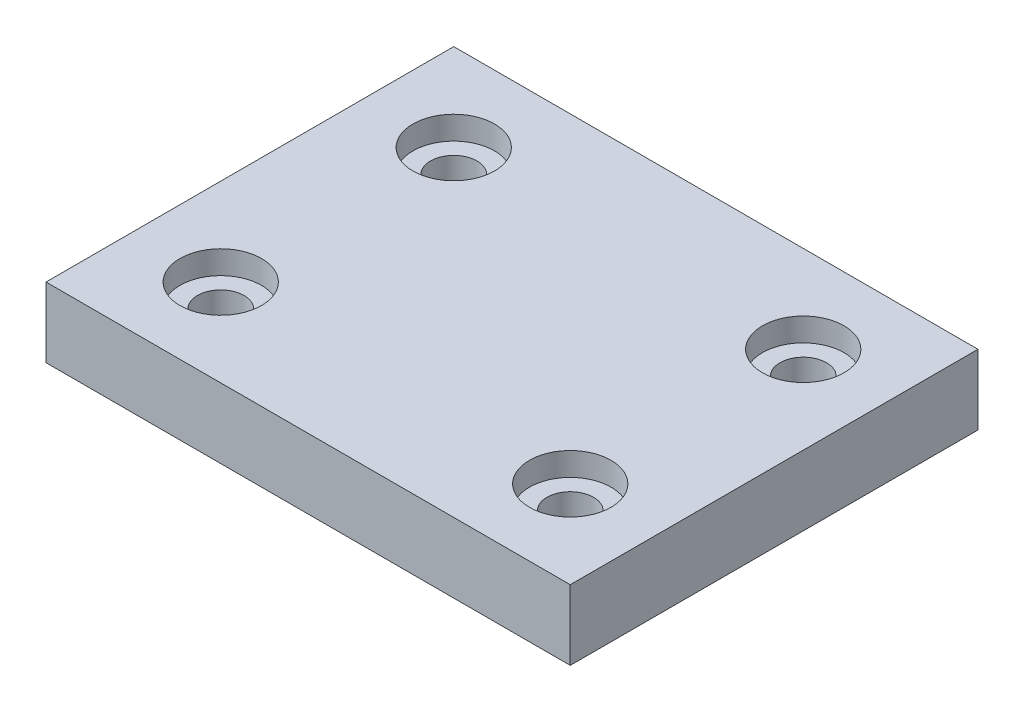
ISO-10303-21;
HEADER;
FILE_DESCRIPTION(('STEP AP214'),'2;1');
FILE_NAME('part.step','',(''),(''),'','','');
FILE_SCHEMA(('AUTOMOTIVE_DESIGN { 1 0 10303 214 1 1 1 1 }'));
ENDSEC;
DATA;
#1=APPLICATION_CONTEXT('core data for automotive mechanical design processes');
#2=APPLICATION_PROTOCOL_DEFINITION('international standard','automotive_design',2000,#1);
#3=PRODUCT_CONTEXT('',#1,'mechanical');
#4=PRODUCT('Part','Part','',(#3));
#5=PRODUCT_RELATED_PRODUCT_CATEGORY('part','',(#4));
#6=PRODUCT_DEFINITION_FORMATION('','',#4);
#7=PRODUCT_DEFINITION_CONTEXT('part definition',#1,'design');
#8=PRODUCT_DEFINITION('design','',#6,#7);
#9=PRODUCT_DEFINITION_SHAPE('','',#8);
#10=(LENGTH_UNIT() NAMED_UNIT(*) SI_UNIT(.MILLI.,.METRE.));
#11=(NAMED_UNIT(*) PLANE_ANGLE_UNIT() SI_UNIT($,.RADIAN.));
#12=(NAMED_UNIT(*) SI_UNIT($,.STERADIAN.) SOLID_ANGLE_UNIT());
#13=UNCERTAINTY_MEASURE_WITH_UNIT(LENGTH_MEASURE(1.E-05),#10,'distance_accuracy_value','');
#14=(GEOMETRIC_REPRESENTATION_CONTEXT(3) GLOBAL_UNCERTAINTY_ASSIGNED_CONTEXT((#13)) GLOBAL_UNIT_ASSIGNED_CONTEXT((#10,
#11,#12)) REPRESENTATION_CONTEXT('',''));
#15=CARTESIAN_POINT('',(0.,0.,0.));
#16=DIRECTION('',(0.,0.,1.));
#17=DIRECTION('',(1.,0.,0.));
#18=AXIS2_PLACEMENT_3D('',#15,#16,#17);
#19=CARTESIAN_POINT('',(-45.,12.,35.));
#20=DIRECTION('',(1.,0.,0.));
#21=DIRECTION('',(0.,0.,-1.));
#22=AXIS2_PLACEMENT_3D('',#19,#20,#21);
#23=PLANE('',#22);
#24=DIRECTION('',(0.,0.,1.));
#25=VECTOR('',#24,1.);
#26=CARTESIAN_POINT('',(-45.,0.,35.));
#27=LINE('',#26,#25);
#28=CARTESIAN_POINT('',(-45.,0.,-35.));
#29=VERTEX_POINT('',#28);
#30=CARTESIAN_POINT('',(-45.,0.,35.));
#31=VERTEX_POINT('',#30);
#32=EDGE_CURVE('E117',#29,#31,#27,.T.);
#33=ORIENTED_EDGE('',*,*,#32,.T.);
#34=DIRECTION('',(0.,-1.,0.));
#35=VECTOR('',#34,1.);
#36=CARTESIAN_POINT('',(-45.,12.,35.));
#37=LINE('',#36,#35);
#38=CARTESIAN_POINT('',(-45.,12.,35.));
#39=VERTEX_POINT('',#38);
#40=EDGE_CURVE('E11',#39,#31,#37,.T.);
#41=ORIENTED_EDGE('',*,*,#40,.F.);
#42=DIRECTION('',(0.,0.,1.));
#43=VECTOR('',#42,1.);
#44=CARTESIAN_POINT('',(-45.,12.,35.));
#45=LINE('',#44,#43);
#46=CARTESIAN_POINT('',(-45.,12.,-35.));
#47=VERTEX_POINT('',#46);
#48=EDGE_CURVE('E99',#47,#39,#45,.T.);
#49=ORIENTED_EDGE('',*,*,#48,.F.);
#50=DIRECTION('',(0.,-1.,0.));
#51=VECTOR('',#50,1.);
#52=CARTESIAN_POINT('',(-45.,12.,-35.));
#53=LINE('',#52,#51);
#54=EDGE_CURVE('E113',#47,#29,#53,.T.);
#55=ORIENTED_EDGE('',*,*,#54,.T.);
#56=EDGE_LOOP('',(#33,#41,#49,#55));
#57=FACE_BOUND('',#56,.T.);
#58=ADVANCED_FACE('F45',(#57),#23,.F.);
#59=CARTESIAN_POINT('',(45.,12.,35.));
#60=DIRECTION('',(0.,0.,-1.));
#61=DIRECTION('',(-1.,0.,0.));
#62=AXIS2_PLACEMENT_3D('',#59,#60,#61);
#63=PLANE('',#62);
#64=DIRECTION('',(1.,0.,0.));
#65=VECTOR('',#64,1.);
#66=CARTESIAN_POINT('',(45.,0.,35.));
#67=LINE('',#66,#65);
#68=CARTESIAN_POINT('',(45.,0.,35.));
#69=VERTEX_POINT('',#68);
#70=EDGE_CURVE('E104',#31,#69,#67,.T.);
#71=ORIENTED_EDGE('',*,*,#70,.T.);
#72=DIRECTION('',(0.,-1.,0.));
#73=VECTOR('',#72,1.);
#74=CARTESIAN_POINT('',(45.,12.,35.));
#75=LINE('',#74,#73);
#76=CARTESIAN_POINT('',(45.,12.,35.));
#77=VERTEX_POINT('',#76);
#78=EDGE_CURVE('E55',#77,#69,#75,.T.);
#79=ORIENTED_EDGE('',*,*,#78,.F.);
#80=DIRECTION('',(1.,0.,0.));
#81=VECTOR('',#80,1.);
#82=CARTESIAN_POINT('',(45.,12.,35.));
#83=LINE('',#82,#81);
#84=EDGE_CURVE('E94',#39,#77,#83,.T.);
#85=ORIENTED_EDGE('',*,*,#84,.F.);
#86=ORIENTED_EDGE('',*,*,#40,.T.);
#87=EDGE_LOOP('',(#71,#79,#85,#86));
#88=FACE_BOUND('',#87,.T.);
#89=ADVANCED_FACE('F103',(#88),#63,.F.);
#90=CARTESIAN_POINT('',(45.,12.,-35.));
#91=DIRECTION('',(-1.,0.,0.));
#92=DIRECTION('',(0.,0.,1.));
#93=AXIS2_PLACEMENT_3D('',#90,#91,#92);
#94=PLANE('',#93);
#95=DIRECTION('',(0.,0.,-1.));
#96=VECTOR('',#95,1.);
#97=CARTESIAN_POINT('',(45.,0.,-35.));
#98=LINE('',#97,#96);
#99=CARTESIAN_POINT('',(45.,0.,-35.));
#100=VERTEX_POINT('',#99);
#101=EDGE_CURVE('E81',#69,#100,#98,.T.);
#102=ORIENTED_EDGE('',*,*,#101,.T.);
#103=DIRECTION('',(0.,-1.,0.));
#104=VECTOR('',#103,1.);
#105=CARTESIAN_POINT('',(45.,12.,-35.));
#106=LINE('',#105,#104);
#107=CARTESIAN_POINT('',(45.,12.,-35.));
#108=VERTEX_POINT('',#107);
#109=EDGE_CURVE('E106',#108,#100,#106,.T.);
#110=ORIENTED_EDGE('',*,*,#109,.F.);
#111=DIRECTION('',(0.,0.,-1.));
#112=VECTOR('',#111,1.);
#113=CARTESIAN_POINT('',(45.,12.,-35.));
#114=LINE('',#113,#112);
#115=EDGE_CURVE('E97',#77,#108,#114,.T.);
#116=ORIENTED_EDGE('',*,*,#115,.F.);
#117=ORIENTED_EDGE('',*,*,#78,.T.);
#118=EDGE_LOOP('',(#102,#110,#116,#117));
#119=FACE_BOUND('',#118,.T.);
#120=ADVANCED_FACE('F108',(#119),#94,.F.);
#121=CARTESIAN_POINT('',(-45.,12.,-35.));
#122=DIRECTION('',(0.,0.,1.));
#123=DIRECTION('',(1.,0.,0.));
#124=AXIS2_PLACEMENT_3D('',#121,#122,#123);
#125=PLANE('',#124);
#126=DIRECTION('',(-1.,0.,0.));
#127=VECTOR('',#126,1.);
#128=CARTESIAN_POINT('',(-45.,0.,-35.));
#129=LINE('',#128,#127);
#130=EDGE_CURVE('E87',#100,#29,#129,.T.);
#131=ORIENTED_EDGE('',*,*,#130,.T.);
#132=ORIENTED_EDGE('',*,*,#54,.F.);
#133=DIRECTION('',(-1.,0.,0.));
#134=VECTOR('',#133,1.);
#135=CARTESIAN_POINT('',(-45.,12.,-35.));
#136=LINE('',#135,#134);
#137=EDGE_CURVE('E64',#108,#47,#136,.T.);
#138=ORIENTED_EDGE('',*,*,#137,.F.);
#139=ORIENTED_EDGE('',*,*,#109,.T.);
#140=EDGE_LOOP('',(#131,#132,#138,#139));
#141=FACE_BOUND('',#140,.T.);
#142=ADVANCED_FACE('F232',(#141),#125,.F.);
#143=CARTESIAN_POINT('',(0.,12.,0.));
#144=DIRECTION('',(0.,-1.,0.));
#145=DIRECTION('',(0.,0.,-1.));
#146=AXIS2_PLACEMENT_3D('',#143,#144,#145);
#147=PLANE('',#146);
#148=CARTESIAN_POINT('',(30.,12.,-20.));
#149=DIRECTION('',(0.,1.,0.));
#150=DIRECTION('',(0.,0.,1.));
#151=AXIS2_PLACEMENT_3D('',#148,#149,#150);
#152=CIRCLE('',#151,7.);
#153=CARTESIAN_POINT('',(30.,12.,-13.));
#154=VERTEX_POINT('',#153);
#155=EDGE_CURVE('E164',#154,#154,#152,.T.);
#156=ORIENTED_EDGE('',*,*,#155,.F.);
#157=EDGE_LOOP('',(#156));
#158=FACE_BOUND('',#157,.T.);
#159=CARTESIAN_POINT('',(-30.,12.,20.));
#160=DIRECTION('',(0.,1.,0.));
#161=DIRECTION('',(0.,0.,1.));
#162=AXIS2_PLACEMENT_3D('',#159,#160,#161);
#163=CIRCLE('',#162,7.);
#164=CARTESIAN_POINT('',(-30.,12.,27.));
#165=VERTEX_POINT('',#164);
#166=EDGE_CURVE('E172',#165,#165,#163,.T.);
#167=ORIENTED_EDGE('',*,*,#166,.F.);
#168=EDGE_LOOP('',(#167));
#169=FACE_BOUND('',#168,.T.);
#170=CARTESIAN_POINT('',(30.,12.,20.));
#171=DIRECTION('',(0.,1.,0.));
#172=DIRECTION('',(0.,0.,1.));
#173=AXIS2_PLACEMENT_3D('',#170,#171,#172);
#174=CIRCLE('',#173,7.);
#175=CARTESIAN_POINT('',(30.,12.,27.));
#176=VERTEX_POINT('',#175);
#177=EDGE_CURVE('E152',#176,#176,#174,.T.);
#178=ORIENTED_EDGE('',*,*,#177,.F.);
#179=EDGE_LOOP('',(#178));
#180=FACE_BOUND('',#179,.T.);
#181=CARTESIAN_POINT('',(-30.,12.,-20.));
#182=DIRECTION('',(0.,1.,0.));
#183=DIRECTION('',(0.,0.,1.));
#184=AXIS2_PLACEMENT_3D('',#181,#182,#183);
#185=CIRCLE('',#184,7.);
#186=CARTESIAN_POINT('',(-30.,12.,-13.));
#187=VERTEX_POINT('',#186);
#188=EDGE_CURVE('E168',#187,#187,#185,.T.);
#189=ORIENTED_EDGE('',*,*,#188,.F.);
#190=EDGE_LOOP('',(#189));
#191=FACE_BOUND('',#190,.T.);
#192=ORIENTED_EDGE('',*,*,#48,.T.);
#193=ORIENTED_EDGE('',*,*,#84,.T.);
#194=ORIENTED_EDGE('',*,*,#115,.T.);
#195=ORIENTED_EDGE('',*,*,#137,.T.);
#196=EDGE_LOOP('',(#192,#193,#194,#195));
#197=FACE_BOUND('',#196,.T.);
#198=ADVANCED_FACE('F95',(#158,#169,#180,#191,#197),#147,.F.);
#199=CARTESIAN_POINT('',(0.,0.,0.));
#200=DIRECTION('',(0.,-1.,0.));
#201=DIRECTION('',(0.,0.,-1.));
#202=AXIS2_PLACEMENT_3D('',#199,#200,#201);
#203=PLANE('',#202);
#204=CARTESIAN_POINT('',(30.,0.,-20.));
#205=DIRECTION('',(0.,1.,0.));
#206=DIRECTION('',(0.,0.,1.));
#207=AXIS2_PLACEMENT_3D('',#204,#205,#206);
#208=CIRCLE('',#207,4.);
#209=CARTESIAN_POINT('',(30.,0.,-16.));
#210=VERTEX_POINT('',#209);
#211=EDGE_CURVE('E185',#210,#210,#208,.T.);
#212=ORIENTED_EDGE('',*,*,#211,.T.);
#213=EDGE_LOOP('',(#212));
#214=FACE_BOUND('',#213,.T.);
#215=CARTESIAN_POINT('',(-30.,0.,20.));
#216=DIRECTION('',(0.,1.,0.));
#217=DIRECTION('',(0.,0.,1.));
#218=AXIS2_PLACEMENT_3D('',#215,#216,#217);
#219=CIRCLE('',#218,4.);
#220=CARTESIAN_POINT('',(-30.,0.,24.));
#221=VERTEX_POINT('',#220);
#222=EDGE_CURVE('E190',#221,#221,#219,.T.);
#223=ORIENTED_EDGE('',*,*,#222,.T.);
#224=EDGE_LOOP('',(#223));
#225=FACE_BOUND('',#224,.T.);
#226=CARTESIAN_POINT('',(30.,0.,20.));
#227=DIRECTION('',(0.,1.,0.));
#228=DIRECTION('',(0.,0.,1.));
#229=AXIS2_PLACEMENT_3D('',#226,#227,#228);
#230=CIRCLE('',#229,4.);
#231=CARTESIAN_POINT('',(30.,0.,24.));
#232=VERTEX_POINT('',#231);
#233=EDGE_CURVE('E195',#232,#232,#230,.T.);
#234=ORIENTED_EDGE('',*,*,#233,.T.);
#235=EDGE_LOOP('',(#234));
#236=FACE_BOUND('',#235,.T.);
#237=CARTESIAN_POINT('',(-30.,0.,-20.));
#238=DIRECTION('',(0.,1.,0.));
#239=DIRECTION('',(0.,0.,1.));
#240=AXIS2_PLACEMENT_3D('',#237,#238,#239);
#241=CIRCLE('',#240,4.);
#242=CARTESIAN_POINT('',(-30.,0.,-16.));
#243=VERTEX_POINT('',#242);
#244=EDGE_CURVE('E137',#243,#243,#241,.T.);
#245=ORIENTED_EDGE('',*,*,#244,.T.);
#246=EDGE_LOOP('',(#245));
#247=FACE_BOUND('',#246,.T.);
#248=ORIENTED_EDGE('',*,*,#32,.F.);
#249=ORIENTED_EDGE('',*,*,#130,.F.);
#250=ORIENTED_EDGE('',*,*,#101,.F.);
#251=ORIENTED_EDGE('',*,*,#70,.F.);
#252=EDGE_LOOP('',(#248,#249,#250,#251));
#253=FACE_BOUND('',#252,.T.);
#254=ADVANCED_FACE('F201',(#214,#225,#236,#247,#253),#203,.T.);
#255=CARTESIAN_POINT('',(-30.,8.,-20.));
#256=DIRECTION('',(0.,1.,0.));
#257=DIRECTION('',(0.,0.,1.));
#258=AXIS2_PLACEMENT_3D('',#255,#256,#257);
#259=CYLINDRICAL_SURFACE('',#258,7.);
#260=CARTESIAN_POINT('',(-30.,8.,-20.));
#261=DIRECTION('',(0.,1.,0.));
#262=DIRECTION('',(0.,0.,1.));
#263=AXIS2_PLACEMENT_3D('',#260,#261,#262);
#264=CIRCLE('',#263,7.);
#265=CARTESIAN_POINT('',(-30.,8.,-13.));
#266=VERTEX_POINT('',#265);
#267=EDGE_CURVE('E121',#266,#266,#264,.T.);
#268=ORIENTED_EDGE('',*,*,#267,.F.);
#269=EDGE_LOOP('',(#268));
#270=FACE_BOUND('',#269,.T.);
#271=ORIENTED_EDGE('',*,*,#188,.T.);
#272=EDGE_LOOP('',(#271));
#273=FACE_BOUND('',#272,.T.);
#274=ADVANCED_FACE('F223',(#270,#273),#259,.F.);
#275=CARTESIAN_POINT('',(-30.,8.,-20.));
#276=DIRECTION('',(0.,1.,0.));
#277=DIRECTION('',(0.,0.,1.));
#278=AXIS2_PLACEMENT_3D('',#275,#276,#277);
#279=PLANE('',#278);
#280=CARTESIAN_POINT('',(-30.,8.,-20.));
#281=DIRECTION('',(0.,1.,0.));
#282=DIRECTION('',(0.,0.,1.));
#283=AXIS2_PLACEMENT_3D('',#280,#281,#282);
#284=CIRCLE('',#283,4.);
#285=CARTESIAN_POINT('',(-30.,8.,-16.));
#286=VERTEX_POINT('',#285);
#287=EDGE_CURVE('E48',#286,#286,#284,.T.);
#288=ORIENTED_EDGE('',*,*,#287,.F.);
#289=EDGE_LOOP('',(#288));
#290=FACE_BOUND('',#289,.T.);
#291=ORIENTED_EDGE('',*,*,#267,.T.);
#292=EDGE_LOOP('',(#291));
#293=FACE_BOUND('',#292,.T.);
#294=ADVANCED_FACE('F229',(#290,#293),#279,.T.);
#295=CARTESIAN_POINT('',(30.,8.,20.));
#296=DIRECTION('',(0.,1.,0.));
#297=DIRECTION('',(0.,0.,1.));
#298=AXIS2_PLACEMENT_3D('',#295,#296,#297);
#299=CYLINDRICAL_SURFACE('',#298,7.);
#300=CARTESIAN_POINT('',(30.,8.,20.));
#301=DIRECTION('',(0.,1.,0.));
#302=DIRECTION('',(0.,0.,1.));
#303=AXIS2_PLACEMENT_3D('',#300,#301,#302);
#304=CIRCLE('',#303,7.);
#305=CARTESIAN_POINT('',(30.,8.,27.));
#306=VERTEX_POINT('',#305);
#307=EDGE_CURVE('E147',#306,#306,#304,.T.);
#308=ORIENTED_EDGE('',*,*,#307,.F.);
#309=EDGE_LOOP('',(#308));
#310=FACE_BOUND('',#309,.T.);
#311=ORIENTED_EDGE('',*,*,#177,.T.);
#312=EDGE_LOOP('',(#311));
#313=FACE_BOUND('',#312,.T.);
#314=ADVANCED_FACE('F263',(#310,#313),#299,.F.);
#315=CARTESIAN_POINT('',(30.,8.,20.));
#316=DIRECTION('',(0.,1.,0.));
#317=DIRECTION('',(0.,0.,1.));
#318=AXIS2_PLACEMENT_3D('',#315,#316,#317);
#319=PLANE('',#318);
#320=CARTESIAN_POINT('',(30.,8.,20.));
#321=DIRECTION('',(0.,1.,0.));
#322=DIRECTION('',(0.,0.,1.));
#323=AXIS2_PLACEMENT_3D('',#320,#321,#322);
#324=CIRCLE('',#323,4.);
#325=CARTESIAN_POINT('',(30.,8.,24.));
#326=VERTEX_POINT('',#325);
#327=EDGE_CURVE('E140',#326,#326,#324,.T.);
#328=ORIENTED_EDGE('',*,*,#327,.F.);
#329=EDGE_LOOP('',(#328));
#330=FACE_BOUND('',#329,.T.);
#331=ORIENTED_EDGE('',*,*,#307,.T.);
#332=EDGE_LOOP('',(#331));
#333=FACE_BOUND('',#332,.T.);
#334=ADVANCED_FACE('F268',(#330,#333),#319,.T.);
#335=CARTESIAN_POINT('',(-30.,8.,20.));
#336=DIRECTION('',(0.,1.,0.));
#337=DIRECTION('',(0.,0.,1.));
#338=AXIS2_PLACEMENT_3D('',#335,#336,#337);
#339=CYLINDRICAL_SURFACE('',#338,7.);
#340=CARTESIAN_POINT('',(-30.,8.,20.));
#341=DIRECTION('',(0.,1.,0.));
#342=DIRECTION('',(0.,0.,1.));
#343=AXIS2_PLACEMENT_3D('',#340,#341,#342);
#344=CIRCLE('',#343,7.);
#345=CARTESIAN_POINT('',(-30.,8.,27.));
#346=VERTEX_POINT('',#345);
#347=EDGE_CURVE('E160',#346,#346,#344,.T.);
#348=ORIENTED_EDGE('',*,*,#347,.F.);
#349=EDGE_LOOP('',(#348));
#350=FACE_BOUND('',#349,.T.);
#351=ORIENTED_EDGE('',*,*,#166,.T.);
#352=EDGE_LOOP('',(#351));
#353=FACE_BOUND('',#352,.T.);
#354=ADVANCED_FACE('F276',(#350,#353),#339,.F.);
#355=CARTESIAN_POINT('',(-30.,8.,20.));
#356=DIRECTION('',(0.,1.,0.));
#357=DIRECTION('',(0.,0.,1.));
#358=AXIS2_PLACEMENT_3D('',#355,#356,#357);
#359=PLANE('',#358);
#360=CARTESIAN_POINT('',(-30.,8.,20.));
#361=DIRECTION('',(0.,1.,0.));
#362=DIRECTION('',(0.,0.,1.));
#363=AXIS2_PLACEMENT_3D('',#360,#361,#362);
#364=CIRCLE('',#363,4.);
#365=CARTESIAN_POINT('',(-30.,8.,24.));
#366=VERTEX_POINT('',#365);
#367=EDGE_CURVE('E136',#366,#366,#364,.T.);
#368=ORIENTED_EDGE('',*,*,#367,.F.);
#369=EDGE_LOOP('',(#368));
#370=FACE_BOUND('',#369,.T.);
#371=ORIENTED_EDGE('',*,*,#347,.T.);
#372=EDGE_LOOP('',(#371));
#373=FACE_BOUND('',#372,.T.);
#374=ADVANCED_FACE('F281',(#370,#373),#359,.T.);
#375=CARTESIAN_POINT('',(30.,8.,-20.));
#376=DIRECTION('',(0.,1.,0.));
#377=DIRECTION('',(0.,0.,1.));
#378=AXIS2_PLACEMENT_3D('',#375,#376,#377);
#379=CYLINDRICAL_SURFACE('',#378,7.);
#380=CARTESIAN_POINT('',(30.,8.,-20.));
#381=DIRECTION('',(0.,1.,0.));
#382=DIRECTION('',(0.,0.,1.));
#383=AXIS2_PLACEMENT_3D('',#380,#381,#382);
#384=CIRCLE('',#383,7.);
#385=CARTESIAN_POINT('',(30.,8.,-13.));
#386=VERTEX_POINT('',#385);
#387=EDGE_CURVE('E169',#386,#386,#384,.T.);
#388=ORIENTED_EDGE('',*,*,#387,.F.);
#389=EDGE_LOOP('',(#388));
#390=FACE_BOUND('',#389,.T.);
#391=ORIENTED_EDGE('',*,*,#155,.T.);
#392=EDGE_LOOP('',(#391));
#393=FACE_BOUND('',#392,.T.);
#394=ADVANCED_FACE('F289',(#390,#393),#379,.F.);
#395=CARTESIAN_POINT('',(30.,8.,-20.));
#396=DIRECTION('',(0.,1.,0.));
#397=DIRECTION('',(0.,0.,1.));
#398=AXIS2_PLACEMENT_3D('',#395,#396,#397);
#399=PLANE('',#398);
#400=CARTESIAN_POINT('',(30.,8.,-20.));
#401=DIRECTION('',(0.,1.,0.));
#402=DIRECTION('',(0.,0.,1.));
#403=AXIS2_PLACEMENT_3D('',#400,#401,#402);
#404=CIRCLE('',#403,4.);
#405=CARTESIAN_POINT('',(30.,8.,-16.));
#406=VERTEX_POINT('',#405);
#407=EDGE_CURVE('E132',#406,#406,#404,.T.);
#408=ORIENTED_EDGE('',*,*,#407,.F.);
#409=EDGE_LOOP('',(#408));
#410=FACE_BOUND('',#409,.T.);
#411=ORIENTED_EDGE('',*,*,#387,.T.);
#412=EDGE_LOOP('',(#411));
#413=FACE_BOUND('',#412,.T.);
#414=ADVANCED_FACE('F293',(#410,#413),#399,.T.);
#415=CARTESIAN_POINT('',(30.,0.,-20.));
#416=DIRECTION('',(0.,1.,0.));
#417=DIRECTION('',(0.,0.,1.));
#418=AXIS2_PLACEMENT_3D('',#415,#416,#417);
#419=CYLINDRICAL_SURFACE('',#418,4.);
#420=ORIENTED_EDGE('',*,*,#407,.T.);
#421=EDGE_LOOP('',(#420));
#422=FACE_BOUND('',#421,.T.);
#423=ORIENTED_EDGE('',*,*,#211,.F.);
#424=EDGE_LOOP('',(#423));
#425=FACE_BOUND('',#424,.T.);
#426=ADVANCED_FACE('F212',(#422,#425),#419,.F.);
#427=CARTESIAN_POINT('',(-30.,0.,20.));
#428=DIRECTION('',(0.,1.,0.));
#429=DIRECTION('',(0.,0.,1.));
#430=AXIS2_PLACEMENT_3D('',#427,#428,#429);
#431=CYLINDRICAL_SURFACE('',#430,4.);
#432=ORIENTED_EDGE('',*,*,#367,.T.);
#433=EDGE_LOOP('',(#432));
#434=FACE_BOUND('',#433,.T.);
#435=ORIENTED_EDGE('',*,*,#222,.F.);
#436=EDGE_LOOP('',(#435));
#437=FACE_BOUND('',#436,.T.);
#438=ADVANCED_FACE('F206',(#434,#437),#431,.F.);
#439=CARTESIAN_POINT('',(30.,0.,20.));
#440=DIRECTION('',(0.,1.,0.));
#441=DIRECTION('',(0.,0.,1.));
#442=AXIS2_PLACEMENT_3D('',#439,#440,#441);
#443=CYLINDRICAL_SURFACE('',#442,4.);
#444=ORIENTED_EDGE('',*,*,#327,.T.);
#445=EDGE_LOOP('',(#444));
#446=FACE_BOUND('',#445,.T.);
#447=ORIENTED_EDGE('',*,*,#233,.F.);
#448=EDGE_LOOP('',(#447));
#449=FACE_BOUND('',#448,.T.);
#450=ADVANCED_FACE('F203',(#446,#449),#443,.F.);
#451=CARTESIAN_POINT('',(-30.,0.,-20.));
#452=DIRECTION('',(0.,1.,0.));
#453=DIRECTION('',(0.,0.,1.));
#454=AXIS2_PLACEMENT_3D('',#451,#452,#453);
#455=CYLINDRICAL_SURFACE('',#454,4.);
#456=ORIENTED_EDGE('',*,*,#287,.T.);
#457=EDGE_LOOP('',(#456));
#458=FACE_BOUND('',#457,.T.);
#459=ORIENTED_EDGE('',*,*,#244,.F.);
#460=EDGE_LOOP('',(#459));
#461=FACE_BOUND('',#460,.T.);
#462=ADVANCED_FACE('F205',(#458,#461),#455,.F.);
#463=CLOSED_SHELL('',(#58,#89,#120,#142,#198,#254,#274,#294,#314,#334,#354,#374,#394,#414,#426,
#438,#450,#462));
#464=MANIFOLD_SOLID_BREP('B2',#463);
#465=ADVANCED_BREP_SHAPE_REPRESENTATION('',(#18,#464),#14);
#466=SHAPE_DEFINITION_REPRESENTATION(#9,#465);
ENDSEC;
END-ISO-10303-21;
